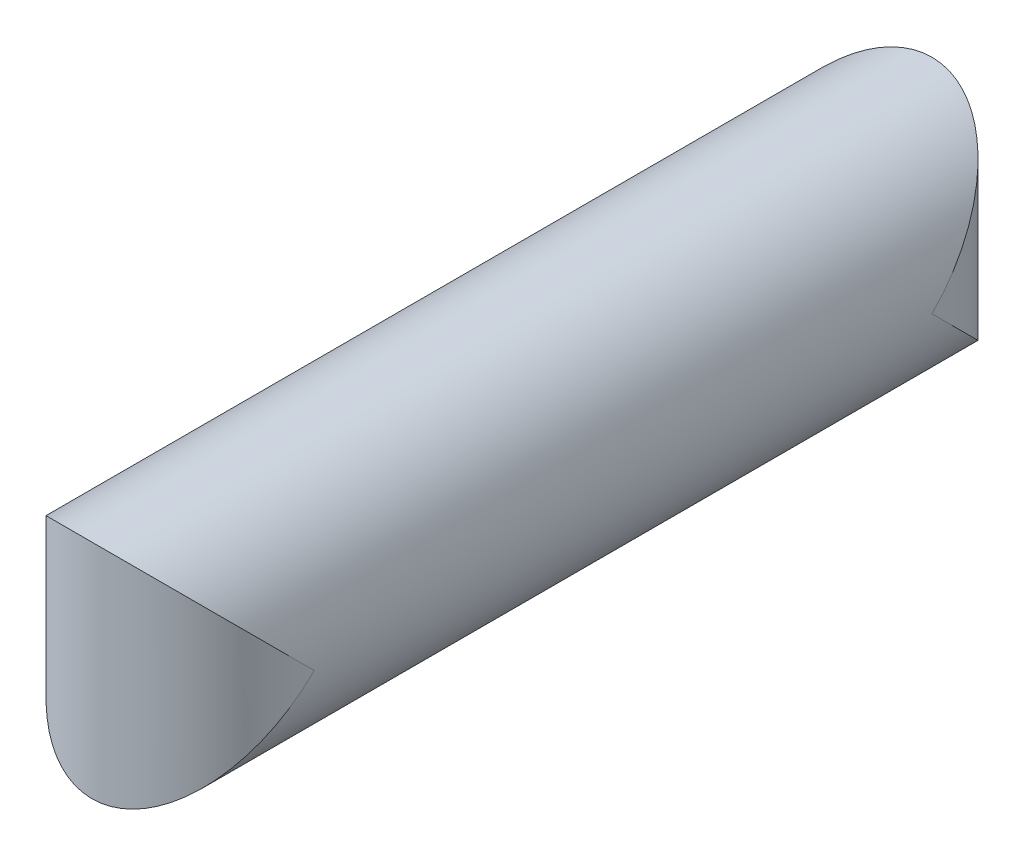
ISO-10303-21;
HEADER;
FILE_DESCRIPTION(('STEP AP214'),'2;1');
FILE_NAME('part.step','',(''),(''),'','','');
FILE_SCHEMA(('AUTOMOTIVE_DESIGN { 1 0 10303 214 1 1 1 1 }'));
ENDSEC;
DATA;
#1=APPLICATION_CONTEXT('core data for automotive mechanical design processes');
#2=APPLICATION_PROTOCOL_DEFINITION('international standard','automotive_design',2000,#1);
#3=PRODUCT_CONTEXT('',#1,'mechanical');
#4=PRODUCT('Part','Part','',(#3));
#5=PRODUCT_RELATED_PRODUCT_CATEGORY('part','',(#4));
#6=PRODUCT_DEFINITION_FORMATION('','',#4);
#7=PRODUCT_DEFINITION_CONTEXT('part definition',#1,'design');
#8=PRODUCT_DEFINITION('design','',#6,#7);
#9=PRODUCT_DEFINITION_SHAPE('','',#8);
#10=(LENGTH_UNIT() NAMED_UNIT(*) SI_UNIT(.MILLI.,.METRE.));
#11=(NAMED_UNIT(*) PLANE_ANGLE_UNIT() SI_UNIT($,.RADIAN.));
#12=(NAMED_UNIT(*) SI_UNIT($,.STERADIAN.) SOLID_ANGLE_UNIT());
#13=UNCERTAINTY_MEASURE_WITH_UNIT(LENGTH_MEASURE(1.E-05),#10,'distance_accuracy_value','');
#14=(GEOMETRIC_REPRESENTATION_CONTEXT(3) GLOBAL_UNCERTAINTY_ASSIGNED_CONTEXT((#13)) GLOBAL_UNIT_ASSIGNED_CONTEXT((#10,
#11,#12)) REPRESENTATION_CONTEXT('',''));
#15=CARTESIAN_POINT('',(0.,0.,0.));
#16=DIRECTION('',(0.,0.,1.));
#17=DIRECTION('',(1.,0.,0.));
#18=AXIS2_PLACEMENT_3D('',#15,#16,#17);
#19=CARTESIAN_POINT('',(0.,0.,30.));
#20=DIRECTION('',(0.,0.,-1.));
#21=DIRECTION('',(-1.,0.,0.));
#22=AXIS2_PLACEMENT_3D('',#19,#20,#21);
#23=CYLINDRICAL_SURFACE('',#22,3.96875);
#24=CARTESIAN_POINT('',(0.,0.,26.03125));
#25=DIRECTION('',(0.,0.707106781186547,-0.707106781186547));
#26=DIRECTION('',(0.,-0.707106781186547,-0.707106781186547));
#27=AXIS2_PLACEMENT_3D('',#24,#25,#26);
#28=ELLIPSE('',#27,5.61266007566822,3.96875);
#29=CARTESIAN_POINT('',(3.96875,0.,26.03125));
#30=VERTEX_POINT('',#29);
#31=CARTESIAN_POINT('',(-3.96875,0.,26.03125));
#32=VERTEX_POINT('',#31);
#33=EDGE_CURVE('E12',#30,#32,#28,.F.);
#34=ORIENTED_EDGE('',*,*,#33,.F.);
#35=CARTESIAN_POINT('',(0.,0.,26.03125));
#36=DIRECTION('',(0.,-0.707106781186547,-0.707106781186547));
#37=DIRECTION('',(0.,0.707106781186547,-0.707106781186547));
#38=AXIS2_PLACEMENT_3D('',#35,#36,#37);
#39=ELLIPSE('',#38,5.61266007566822,3.96875);
#40=EDGE_CURVE('E76',#32,#30,#39,.F.);
#41=ORIENTED_EDGE('',*,*,#40,.F.);
#42=EDGE_LOOP('',(#34,#41));
#43=FACE_BOUND('',#42,.T.);
#44=CARTESIAN_POINT('',(0.,0.,3.96875));
#45=DIRECTION('',(0.,-0.707106781186547,-0.707106781186547));
#46=DIRECTION('',(0.,0.707106781186547,-0.707106781186547));
#47=AXIS2_PLACEMENT_3D('',#44,#45,#46);
#48=ELLIPSE('',#47,5.61266007566822,3.96875);
#49=CARTESIAN_POINT('',(-3.96875,0.,3.96875));
#50=VERTEX_POINT('',#49);
#51=CARTESIAN_POINT('',(3.96875,0.,3.96875));
#52=VERTEX_POINT('',#51);
#53=EDGE_CURVE('E93',#50,#52,#48,.T.);
#54=ORIENTED_EDGE('',*,*,#53,.F.);
#55=CARTESIAN_POINT('',(0.,0.,3.96875));
#56=DIRECTION('',(0.,0.707106781186547,-0.707106781186547));
#57=DIRECTION('',(0.,-0.707106781186547,-0.707106781186547));
#58=AXIS2_PLACEMENT_3D('',#55,#56,#57);
#59=ELLIPSE('',#58,5.61266007566822,3.96875);
#60=EDGE_CURVE('E90',#52,#50,#59,.T.);
#61=ORIENTED_EDGE('',*,*,#60,.F.);
#62=EDGE_LOOP('',(#54,#61));
#63=FACE_BOUND('',#62,.T.);
#64=ADVANCED_FACE('F69',(#43,#63),#23,.T.);
#65=CARTESIAN_POINT('',(0.,-3.96875,26.03125));
#66=DIRECTION('',(0.,1.,0.));
#67=DIRECTION('',(0.,0.,1.));
#68=AXIS2_PLACEMENT_3D('',#65,#66,#67);
#69=CYLINDRICAL_SURFACE('',#68,3.96875);
#70=ORIENTED_EDGE('',*,*,#33,.T.);
#71=ORIENTED_EDGE('',*,*,#40,.T.);
#72=EDGE_LOOP('',(#70,#71));
#73=FACE_BOUND('',#72,.T.);
#74=ADVANCED_FACE('F98',(#73),#69,.T.);
#75=CARTESIAN_POINT('',(0.,-3.96875,3.96875));
#76=DIRECTION('',(0.,1.,0.));
#77=DIRECTION('',(0.,0.,1.));
#78=AXIS2_PLACEMENT_3D('',#75,#76,#77);
#79=CYLINDRICAL_SURFACE('',#78,3.96875);
#80=ORIENTED_EDGE('',*,*,#60,.T.);
#81=ORIENTED_EDGE('',*,*,#53,.T.);
#82=EDGE_LOOP('',(#80,#81));
#83=FACE_BOUND('',#82,.T.);
#84=ADVANCED_FACE('F92',(#83),#79,.T.);
#85=CLOSED_SHELL('',(#64,#74,#84));
#86=MANIFOLD_SOLID_BREP('B2',#85);
#87=ADVANCED_BREP_SHAPE_REPRESENTATION('',(#18,#86),#14);
#88=SHAPE_DEFINITION_REPRESENTATION(#9,#87);
ENDSEC;
END-ISO-10303-21;
